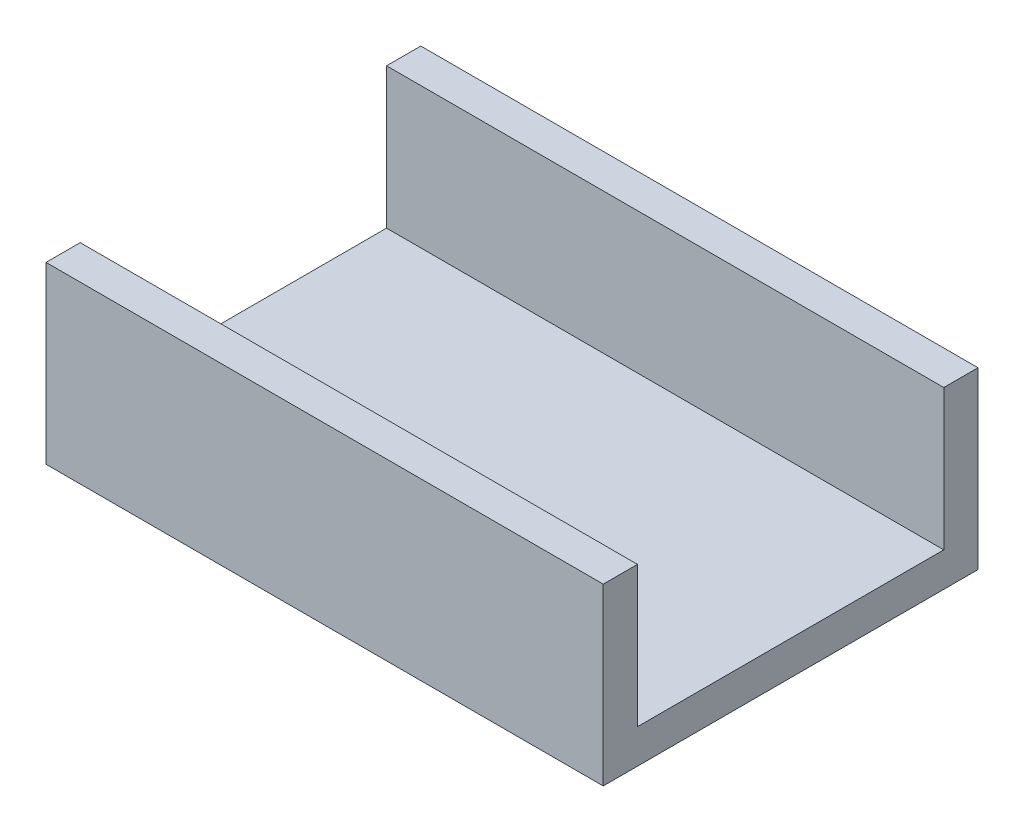
ISO-10303-21;
HEADER;
FILE_DESCRIPTION(('STEP AP214'),'2;1');
FILE_NAME('part.step','',(''),(''),'','','');
FILE_SCHEMA(('AUTOMOTIVE_DESIGN { 1 0 10303 214 1 1 1 1 }'));
ENDSEC;
DATA;
#1=APPLICATION_CONTEXT('core data for automotive mechanical design processes');
#2=APPLICATION_PROTOCOL_DEFINITION('international standard','automotive_design',2000,#1);
#3=PRODUCT_CONTEXT('',#1,'mechanical');
#4=PRODUCT('Part','Part','',(#3));
#5=PRODUCT_RELATED_PRODUCT_CATEGORY('part','',(#4));
#6=PRODUCT_DEFINITION_FORMATION('','',#4);
#7=PRODUCT_DEFINITION_CONTEXT('part definition',#1,'design');
#8=PRODUCT_DEFINITION('design','',#6,#7);
#9=PRODUCT_DEFINITION_SHAPE('','',#8);
#10=(LENGTH_UNIT() NAMED_UNIT(*) SI_UNIT(.MILLI.,.METRE.));
#11=(NAMED_UNIT(*) PLANE_ANGLE_UNIT() SI_UNIT($,.RADIAN.));
#12=(NAMED_UNIT(*) SI_UNIT($,.STERADIAN.) SOLID_ANGLE_UNIT());
#13=UNCERTAINTY_MEASURE_WITH_UNIT(LENGTH_MEASURE(1.E-05),#10,'distance_accuracy_value','');
#14=(GEOMETRIC_REPRESENTATION_CONTEXT(3) GLOBAL_UNCERTAINTY_ASSIGNED_CONTEXT((#13)) GLOBAL_UNIT_ASSIGNED_CONTEXT((#10,
#11,#12)) REPRESENTATION_CONTEXT('',''));
#15=CARTESIAN_POINT('',(0.,0.,0.));
#16=DIRECTION('',(0.,0.,1.));
#17=DIRECTION('',(1.,0.,0.));
#18=AXIS2_PLACEMENT_3D('',#15,#16,#17);
#19=CARTESIAN_POINT('',(0.,10.,0.));
#20=DIRECTION('',(0.,1.,0.));
#21=DIRECTION('',(0.,0.,1.));
#22=AXIS2_PLACEMENT_3D('',#19,#20,#21);
#23=PLANE('',#22);
#24=DIRECTION('',(1.,0.,0.));
#25=VECTOR('',#24,1.);
#26=CARTESIAN_POINT('',(-81.4205280688452,10.,-44.7588941923972));
#27=LINE('',#26,#25);
#28=CARTESIAN_POINT('',(-81.4205280688452,10.,-44.7588941923972));
#29=VERTEX_POINT('',#28);
#30=CARTESIAN_POINT('',(81.4205280688452,10.,-44.7588941923972));
#31=VERTEX_POINT('',#30);
#32=EDGE_CURVE('E121',#29,#31,#27,.T.);
#33=ORIENTED_EDGE('',*,*,#32,.F.);
#34=DIRECTION('',(0.,0.,1.));
#35=VECTOR('',#34,1.);
#36=CARTESIAN_POINT('',(-81.4205280688452,10.,-54.7588941923972));
#37=LINE('',#36,#35);
#38=CARTESIAN_POINT('',(-81.4205280688452,10.,44.7588941923972));
#39=VERTEX_POINT('',#38);
#40=EDGE_CURVE('E125',#29,#39,#37,.T.);
#41=ORIENTED_EDGE('',*,*,#40,.T.);
#42=DIRECTION('',(1.,0.,0.));
#43=VECTOR('',#42,1.);
#44=CARTESIAN_POINT('',(-81.4205280688452,10.,44.7588941923972));
#45=LINE('',#44,#43);
#46=CARTESIAN_POINT('',(81.4205280688452,10.,44.7588941923972));
#47=VERTEX_POINT('',#46);
#48=EDGE_CURVE('E135',#39,#47,#45,.T.);
#49=ORIENTED_EDGE('',*,*,#48,.T.);
#50=DIRECTION('',(0.,0.,-1.));
#51=VECTOR('',#50,1.);
#52=CARTESIAN_POINT('',(81.4205280688452,10.,-54.7588941923972));
#53=LINE('',#52,#51);
#54=EDGE_CURVE('E48',#47,#31,#53,.T.);
#55=ORIENTED_EDGE('',*,*,#54,.T.);
#56=EDGE_LOOP('',(#33,#41,#49,#55));
#57=FACE_BOUND('',#56,.T.);
#58=ADVANCED_FACE('F33',(#57),#23,.T.);
#59=CARTESIAN_POINT('',(81.4205280688452,10.,-54.7588941923972));
#60=DIRECTION('',(-1.,0.,0.));
#61=DIRECTION('',(0.,0.,1.));
#62=AXIS2_PLACEMENT_3D('',#59,#60,#61);
#63=PLANE('',#62);
#64=DIRECTION('',(0.,0.,-1.));
#65=VECTOR('',#64,1.);
#66=CARTESIAN_POINT('',(81.4205280688452,0.,-54.7588941923972));
#67=LINE('',#66,#65);
#68=CARTESIAN_POINT('',(81.4205280688452,0.,54.7588941923972));
#69=VERTEX_POINT('',#68);
#70=CARTESIAN_POINT('',(81.4205280688452,0.,-54.7588941923972));
#71=VERTEX_POINT('',#70);
#72=EDGE_CURVE('E147',#69,#71,#67,.T.);
#73=ORIENTED_EDGE('',*,*,#72,.T.);
#74=DIRECTION('',(0.,-1.,0.));
#75=VECTOR('',#74,1.);
#76=CARTESIAN_POINT('',(81.4205280688452,10.,-54.7588941923972));
#77=LINE('',#76,#75);
#78=CARTESIAN_POINT('',(81.4205280688452,51.0858797154663,-54.7588941923972));
#79=VERTEX_POINT('',#78);
#80=EDGE_CURVE('E11',#79,#71,#77,.T.);
#81=ORIENTED_EDGE('',*,*,#80,.F.);
#82=DIRECTION('',(0.,0.,-1.));
#83=VECTOR('',#82,1.);
#84=CARTESIAN_POINT('',(81.4205280688452,51.0858797154663,-44.7588941923972));
#85=LINE('',#84,#83);
#86=CARTESIAN_POINT('',(81.4205280688452,51.0858797154663,-44.7588941923972));
#87=VERTEX_POINT('',#86);
#88=EDGE_CURVE('E120',#87,#79,#85,.T.);
#89=ORIENTED_EDGE('',*,*,#88,.F.);
#90=DIRECTION('',(0.,1.,0.));
#91=VECTOR('',#90,1.);
#92=CARTESIAN_POINT('',(81.4205280688452,10.,-44.7588941923972));
#93=LINE('',#92,#91);
#94=EDGE_CURVE('E107',#31,#87,#93,.T.);
#95=ORIENTED_EDGE('',*,*,#94,.F.);
#96=ORIENTED_EDGE('',*,*,#54,.F.);
#97=DIRECTION('',(0.,1.,0.));
#98=VECTOR('',#97,1.);
#99=CARTESIAN_POINT('',(81.4205280688452,10.,44.7588941923972));
#100=LINE('',#99,#98);
#101=CARTESIAN_POINT('',(81.4205280688452,51.0858797154663,44.7588941923972));
#102=VERTEX_POINT('',#101);
#103=EDGE_CURVE('E56',#47,#102,#100,.T.);
#104=ORIENTED_EDGE('',*,*,#103,.T.);
#105=DIRECTION('',(0.,0.,1.));
#106=VECTOR('',#105,1.);
#107=CARTESIAN_POINT('',(81.4205280688452,51.0858797154663,44.7588941923972));
#108=LINE('',#107,#106);
#109=CARTESIAN_POINT('',(81.4205280688452,51.0858797154663,54.7588941923972));
#110=VERTEX_POINT('',#109);
#111=EDGE_CURVE('E141',#102,#110,#108,.T.);
#112=ORIENTED_EDGE('',*,*,#111,.T.);
#113=DIRECTION('',(0.,-1.,0.));
#114=VECTOR('',#113,1.);
#115=CARTESIAN_POINT('',(81.4205280688452,10.,54.7588941923972));
#116=LINE('',#115,#114);
#117=EDGE_CURVE('E153',#110,#69,#116,.T.);
#118=ORIENTED_EDGE('',*,*,#117,.T.);
#119=EDGE_LOOP('',(#73,#81,#89,#95,#96,#104,#112,#118));
#120=FACE_BOUND('',#119,.T.);
#121=ADVANCED_FACE('F35',(#120),#63,.F.);
#122=CARTESIAN_POINT('',(-81.4205280688452,10.,-54.7588941923972));
#123=DIRECTION('',(0.,0.,1.));
#124=DIRECTION('',(1.,0.,0.));
#125=AXIS2_PLACEMENT_3D('',#122,#123,#124);
#126=PLANE('',#125);
#127=DIRECTION('',(-1.,0.,0.));
#128=VECTOR('',#127,1.);
#129=CARTESIAN_POINT('',(-81.4205280688452,0.,-54.7588941923972));
#130=LINE('',#129,#128);
#131=CARTESIAN_POINT('',(-81.4205280688452,0.,-54.7588941923972));
#132=VERTEX_POINT('',#131);
#133=EDGE_CURVE('E156',#71,#132,#130,.T.);
#134=ORIENTED_EDGE('',*,*,#133,.T.);
#135=DIRECTION('',(0.,-1.,0.));
#136=VECTOR('',#135,1.);
#137=CARTESIAN_POINT('',(-81.4205280688452,10.,-54.7588941923972));
#138=LINE('',#137,#136);
#139=CARTESIAN_POINT('',(-81.4205280688452,51.0858797154663,-54.7588941923972));
#140=VERTEX_POINT('',#139);
#141=EDGE_CURVE('E41',#140,#132,#138,.T.);
#142=ORIENTED_EDGE('',*,*,#141,.F.);
#143=DIRECTION('',(-1.,0.,0.));
#144=VECTOR('',#143,1.);
#145=CARTESIAN_POINT('',(-81.4205280688452,51.0858797154663,-54.7588941923972));
#146=LINE('',#145,#144);
#147=EDGE_CURVE('E117',#79,#140,#146,.T.);
#148=ORIENTED_EDGE('',*,*,#147,.F.);
#149=ORIENTED_EDGE('',*,*,#80,.T.);
#150=EDGE_LOOP('',(#134,#142,#148,#149));
#151=FACE_BOUND('',#150,.T.);
#152=ADVANCED_FACE('F179',(#151),#126,.F.);
#153=CARTESIAN_POINT('',(-81.4205280688452,10.,-54.7588941923972));
#154=DIRECTION('',(1.,0.,0.));
#155=DIRECTION('',(0.,0.,-1.));
#156=AXIS2_PLACEMENT_3D('',#153,#154,#155);
#157=PLANE('',#156);
#158=DIRECTION('',(0.,0.,1.));
#159=VECTOR('',#158,1.);
#160=CARTESIAN_POINT('',(-81.4205280688452,0.,-54.7588941923972));
#161=LINE('',#160,#159);
#162=CARTESIAN_POINT('',(-81.4205280688452,0.,54.7588941923972));
#163=VERTEX_POINT('',#162);
#164=EDGE_CURVE('E158',#132,#163,#161,.T.);
#165=ORIENTED_EDGE('',*,*,#164,.T.);
#166=DIRECTION('',(0.,-1.,0.));
#167=VECTOR('',#166,1.);
#168=CARTESIAN_POINT('',(-81.4205280688452,10.,54.7588941923972));
#169=LINE('',#168,#167);
#170=CARTESIAN_POINT('',(-81.4205280688452,51.0858797154663,54.7588941923972));
#171=VERTEX_POINT('',#170);
#172=EDGE_CURVE('E163',#171,#163,#169,.T.);
#173=ORIENTED_EDGE('',*,*,#172,.F.);
#174=DIRECTION('',(0.,0.,1.));
#175=VECTOR('',#174,1.);
#176=CARTESIAN_POINT('',(-81.4205280688452,51.0858797154663,44.7588941923972));
#177=LINE('',#176,#175);
#178=CARTESIAN_POINT('',(-81.4205280688452,51.0858797154663,44.7588941923972));
#179=VERTEX_POINT('',#178);
#180=EDGE_CURVE('E144',#179,#171,#177,.T.);
#181=ORIENTED_EDGE('',*,*,#180,.F.);
#182=DIRECTION('',(0.,-1.,0.));
#183=VECTOR('',#182,1.);
#184=CARTESIAN_POINT('',(-81.4205280688452,10.,44.7588941923972));
#185=LINE('',#184,#183);
#186=EDGE_CURVE('E133',#179,#39,#185,.T.);
#187=ORIENTED_EDGE('',*,*,#186,.T.);
#188=ORIENTED_EDGE('',*,*,#40,.F.);
#189=DIRECTION('',(0.,-1.,0.));
#190=VECTOR('',#189,1.);
#191=CARTESIAN_POINT('',(-81.4205280688452,10.,-44.7588941923972));
#192=LINE('',#191,#190);
#193=CARTESIAN_POINT('',(-81.4205280688452,51.0858797154663,-44.7588941923972));
#194=VERTEX_POINT('',#193);
#195=EDGE_CURVE('E105',#194,#29,#192,.T.);
#196=ORIENTED_EDGE('',*,*,#195,.F.);
#197=DIRECTION('',(0.,0.,-1.));
#198=VECTOR('',#197,1.);
#199=CARTESIAN_POINT('',(-81.4205280688452,51.0858797154663,-44.7588941923972));
#200=LINE('',#199,#198);
#201=EDGE_CURVE('E114',#194,#140,#200,.T.);
#202=ORIENTED_EDGE('',*,*,#201,.T.);
#203=ORIENTED_EDGE('',*,*,#141,.T.);
#204=EDGE_LOOP('',(#165,#173,#181,#187,#188,#196,#202,#203));
#205=FACE_BOUND('',#204,.T.);
#206=ADVANCED_FACE('F123',(#205),#157,.F.);
#207=CARTESIAN_POINT('',(-81.4205280688452,10.,54.7588941923972));
#208=DIRECTION('',(0.,0.,-1.));
#209=DIRECTION('',(-1.,0.,0.));
#210=AXIS2_PLACEMENT_3D('',#207,#208,#209);
#211=PLANE('',#210);
#212=DIRECTION('',(1.,0.,0.));
#213=VECTOR('',#212,1.);
#214=CARTESIAN_POINT('',(-81.4205280688452,0.,54.7588941923972));
#215=LINE('',#214,#213);
#216=EDGE_CURVE('E151',#163,#69,#215,.T.);
#217=ORIENTED_EDGE('',*,*,#216,.T.);
#218=ORIENTED_EDGE('',*,*,#117,.F.);
#219=DIRECTION('',(-1.,0.,0.));
#220=VECTOR('',#219,1.);
#221=CARTESIAN_POINT('',(-81.4205280688452,51.0858797154663,54.7588941923972));
#222=LINE('',#221,#220);
#223=EDGE_CURVE('E131',#110,#171,#222,.T.);
#224=ORIENTED_EDGE('',*,*,#223,.T.);
#225=ORIENTED_EDGE('',*,*,#172,.T.);
#226=EDGE_LOOP('',(#217,#218,#224,#225));
#227=FACE_BOUND('',#226,.T.);
#228=ADVANCED_FACE('F172',(#227),#211,.F.);
#229=CARTESIAN_POINT('',(0.,0.,0.));
#230=DIRECTION('',(0.,1.,0.));
#231=DIRECTION('',(0.,0.,1.));
#232=AXIS2_PLACEMENT_3D('',#229,#230,#231);
#233=PLANE('',#232);
#234=ORIENTED_EDGE('',*,*,#72,.F.);
#235=ORIENTED_EDGE('',*,*,#216,.F.);
#236=ORIENTED_EDGE('',*,*,#164,.F.);
#237=ORIENTED_EDGE('',*,*,#133,.F.);
#238=EDGE_LOOP('',(#234,#235,#236,#237));
#239=FACE_BOUND('',#238,.T.);
#240=ADVANCED_FACE('F170',(#239),#233,.F.);
#241=CARTESIAN_POINT('',(-81.4205280688452,51.0858797154663,44.7588941923972));
#242=DIRECTION('',(0.,1.,0.));
#243=DIRECTION('',(0.,0.,1.));
#244=AXIS2_PLACEMENT_3D('',#241,#242,#243);
#245=PLANE('',#244);
#246=ORIENTED_EDGE('',*,*,#223,.F.);
#247=ORIENTED_EDGE('',*,*,#111,.F.);
#248=DIRECTION('',(-1.,0.,0.));
#249=VECTOR('',#248,1.);
#250=CARTESIAN_POINT('',(-81.4205280688452,51.0858797154663,44.7588941923972));
#251=LINE('',#250,#249);
#252=EDGE_CURVE('E138',#102,#179,#251,.T.);
#253=ORIENTED_EDGE('',*,*,#252,.T.);
#254=ORIENTED_EDGE('',*,*,#180,.T.);
#255=EDGE_LOOP('',(#246,#247,#253,#254));
#256=FACE_BOUND('',#255,.T.);
#257=ADVANCED_FACE('F176',(#256),#245,.T.);
#258=CARTESIAN_POINT('',(0.,0.,44.7588941923972));
#259=DIRECTION('',(0.,0.,-1.));
#260=DIRECTION('',(-1.,0.,0.));
#261=AXIS2_PLACEMENT_3D('',#258,#259,#260);
#262=PLANE('',#261);
#263=ORIENTED_EDGE('',*,*,#186,.F.);
#264=ORIENTED_EDGE('',*,*,#252,.F.);
#265=ORIENTED_EDGE('',*,*,#103,.F.);
#266=ORIENTED_EDGE('',*,*,#48,.F.);
#267=EDGE_LOOP('',(#263,#264,#265,#266));
#268=FACE_BOUND('',#267,.T.);
#269=ADVANCED_FACE('F178',(#268),#262,.T.);
#270=CARTESIAN_POINT('',(-81.4205280688452,51.0858797154663,-44.7588941923972));
#271=DIRECTION('',(0.,-1.,0.));
#272=DIRECTION('',(0.,0.,-1.));
#273=AXIS2_PLACEMENT_3D('',#270,#271,#272);
#274=PLANE('',#273);
#275=ORIENTED_EDGE('',*,*,#147,.T.);
#276=ORIENTED_EDGE('',*,*,#201,.F.);
#277=DIRECTION('',(-1.,0.,0.));
#278=VECTOR('',#277,1.);
#279=CARTESIAN_POINT('',(-81.4205280688452,51.0858797154663,-44.7588941923972));
#280=LINE('',#279,#278);
#281=EDGE_CURVE('E101',#87,#194,#280,.T.);
#282=ORIENTED_EDGE('',*,*,#281,.F.);
#283=ORIENTED_EDGE('',*,*,#88,.T.);
#284=EDGE_LOOP('',(#275,#276,#282,#283));
#285=FACE_BOUND('',#284,.T.);
#286=ADVANCED_FACE('F115',(#285),#274,.F.);
#287=CARTESIAN_POINT('',(0.,0.,-44.7588941923972));
#288=DIRECTION('',(0.,0.,1.));
#289=DIRECTION('',(-1.,0.,0.));
#290=AXIS2_PLACEMENT_3D('',#287,#288,#289);
#291=PLANE('',#290);
#292=ORIENTED_EDGE('',*,*,#195,.T.);
#293=ORIENTED_EDGE('',*,*,#32,.T.);
#294=ORIENTED_EDGE('',*,*,#94,.T.);
#295=ORIENTED_EDGE('',*,*,#281,.T.);
#296=EDGE_LOOP('',(#292,#293,#294,#295));
#297=FACE_BOUND('',#296,.T.);
#298=ADVANCED_FACE('F103',(#297),#291,.T.);
#299=CLOSED_SHELL('',(#58,#121,#152,#206,#228,#240,#257,#269,#286,#298));
#300=MANIFOLD_SOLID_BREP('B2',#299);
#301=ADVANCED_BREP_SHAPE_REPRESENTATION('',(#18,#300),#14);
#302=SHAPE_DEFINITION_REPRESENTATION(#9,#301);
ENDSEC;
END-ISO-10303-21;
